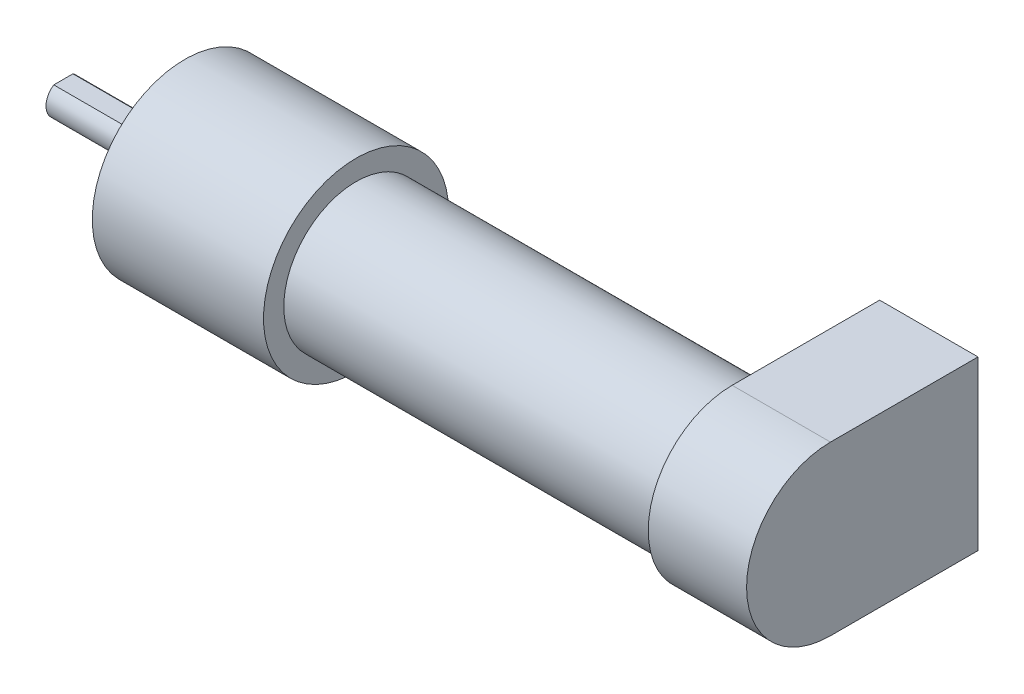
ISO-10303-21;
HEADER;
FILE_DESCRIPTION(('STEP AP214'),'2;1');
FILE_NAME('part.step','',(''),(''),'','','');
FILE_SCHEMA(('AUTOMOTIVE_DESIGN { 1 0 10303 214 1 1 1 1 }'));
ENDSEC;
DATA;
#1=APPLICATION_CONTEXT('core data for automotive mechanical design processes');
#2=APPLICATION_PROTOCOL_DEFINITION('international standard','automotive_design',2000,#1);
#3=PRODUCT_CONTEXT('',#1,'mechanical');
#4=PRODUCT('Part','Part','',(#3));
#5=PRODUCT_RELATED_PRODUCT_CATEGORY('part','',(#4));
#6=PRODUCT_DEFINITION_FORMATION('','',#4);
#7=PRODUCT_DEFINITION_CONTEXT('part definition',#1,'design');
#8=PRODUCT_DEFINITION('design','',#6,#7);
#9=PRODUCT_DEFINITION_SHAPE('','',#8);
#10=(LENGTH_UNIT() NAMED_UNIT(*) SI_UNIT(.MILLI.,.METRE.));
#11=(NAMED_UNIT(*) PLANE_ANGLE_UNIT() SI_UNIT($,.RADIAN.));
#12=(NAMED_UNIT(*) SI_UNIT($,.STERADIAN.) SOLID_ANGLE_UNIT());
#13=UNCERTAINTY_MEASURE_WITH_UNIT(LENGTH_MEASURE(1.E-05),#10,'distance_accuracy_value','');
#14=(GEOMETRIC_REPRESENTATION_CONTEXT(3) GLOBAL_UNCERTAINTY_ASSIGNED_CONTEXT((#13)) GLOBAL_UNIT_ASSIGNED_CONTEXT((#10,
#11,#12)) REPRESENTATION_CONTEXT('',''));
#15=CARTESIAN_POINT('',(0.,0.,0.));
#16=DIRECTION('',(0.,0.,1.));
#17=DIRECTION('',(1.,0.,0.));
#18=AXIS2_PLACEMENT_3D('',#15,#16,#17);
#19=CARTESIAN_POINT('',(-43.621133370613,-0.469072188427009,0.));
#20=DIRECTION('',(-1.,0.,0.));
#21=DIRECTION('',(0.,0.,1.));
#22=AXIS2_PLACEMENT_3D('',#19,#20,#21);
#23=PLANE('',#22);
#24=DIRECTION('',(0.,0.,-1.));
#25=VECTOR('',#24,1.);
#26=CARTESIAN_POINT('',(-43.621133370613,0.53092781157299,-1.6583123951777));
#27=LINE('',#26,#25);
#28=CARTESIAN_POINT('',(-43.621133370613,0.530927811572991,1.65831239517771));
#29=VERTEX_POINT('',#28);
#30=CARTESIAN_POINT('',(-43.621133370613,0.530927811572991,-1.65831239517771));
#31=VERTEX_POINT('',#30);
#32=EDGE_CURVE('E76',#29,#31,#27,.T.);
#33=ORIENTED_EDGE('',*,*,#32,.T.);
#34=CARTESIAN_POINT('',(-43.621133370613,-1.96907218842701,0.));
#35=DIRECTION('',(1.,0.,0.));
#36=DIRECTION('',(0.,0.,-1.));
#37=AXIS2_PLACEMENT_3D('',#34,#35,#36);
#38=CIRCLE('',#37,3.);
#39=EDGE_CURVE('E20',#29,#31,#38,.T.);
#40=ORIENTED_EDGE('',*,*,#39,.F.);
#41=EDGE_LOOP('',(#33,#40));
#42=FACE_BOUND('',#41,.T.);
#43=ADVANCED_FACE('F17',(#42),#23,.T.);
#44=CARTESIAN_POINT('',(-43.621133370613,0.53092781157299,-1.6583123951777));
#45=DIRECTION('',(0.,-1.,0.));
#46=DIRECTION('',(0.,0.,-1.));
#47=AXIS2_PLACEMENT_3D('',#44,#45,#46);
#48=PLANE('',#47);
#49=DIRECTION('',(1.,0.,0.));
#50=VECTOR('',#49,1.);
#51=CARTESIAN_POINT('',(-35.546133370613,0.530927811572992,-1.65831239517771));
#52=LINE('',#51,#50);
#53=CARTESIAN_POINT('',(-31.621133370613,0.530927811572991,-1.65831239517771));
#54=VERTEX_POINT('',#53);
#55=EDGE_CURVE('E85',#31,#54,#52,.T.);
#56=ORIENTED_EDGE('',*,*,#55,.F.);
#57=ORIENTED_EDGE('',*,*,#32,.F.);
#58=DIRECTION('',(1.,0.,0.));
#59=VECTOR('',#58,1.);
#60=CARTESIAN_POINT('',(-35.546133370613,0.530927811572991,1.65831239517771));
#61=LINE('',#60,#59);
#62=CARTESIAN_POINT('',(-31.621133370613,0.530927811572991,1.65831239517771));
#63=VERTEX_POINT('',#62);
#64=EDGE_CURVE('E95',#63,#29,#61,.F.);
#65=ORIENTED_EDGE('',*,*,#64,.F.);
#66=DIRECTION('',(0.,0.,-1.));
#67=VECTOR('',#66,1.);
#68=CARTESIAN_POINT('',(-31.621133370613,0.53092781157299,0.));
#69=LINE('',#68,#67);
#70=EDGE_CURVE('E82',#63,#54,#69,.T.);
#71=ORIENTED_EDGE('',*,*,#70,.T.);
#72=EDGE_LOOP('',(#56,#57,#65,#71));
#73=FACE_BOUND('',#72,.T.);
#74=ADVANCED_FACE('F86',(#73),#48,.F.);
#75=CARTESIAN_POINT('',(-31.621133370613,0.68440672503776,0.));
#76=DIRECTION('',(1.,0.,0.));
#77=DIRECTION('',(0.,0.,-1.));
#78=AXIS2_PLACEMENT_3D('',#75,#76,#77);
#79=PLANE('',#78);
#80=ORIENTED_EDGE('',*,*,#70,.F.);
#81=CARTESIAN_POINT('',(-31.621133370613,-1.96907218842701,0.));
#82=DIRECTION('',(1.,0.,0.));
#83=DIRECTION('',(0.,0.,-1.));
#84=AXIS2_PLACEMENT_3D('',#81,#82,#83);
#85=CIRCLE('',#84,3.);
#86=EDGE_CURVE('E92',#54,#63,#85,.T.);
#87=ORIENTED_EDGE('',*,*,#86,.F.);
#88=EDGE_LOOP('',(#80,#87));
#89=FACE_BOUND('',#88,.T.);
#90=ADVANCED_FACE('F148',(#89),#79,.F.);
#91=CARTESIAN_POINT('',(-35.546133370613,-1.96907218842701,0.));
#92=DIRECTION('',(1.,0.,0.));
#93=DIRECTION('',(0.,0.,-1.));
#94=AXIS2_PLACEMENT_3D('',#91,#92,#93);
#95=CYLINDRICAL_SURFACE('',#94,3.);
#96=CARTESIAN_POINT('',(-27.471133370613,-1.96907218842701,0.));
#97=DIRECTION('',(1.,0.,0.));
#98=DIRECTION('',(0.,0.,-1.));
#99=AXIS2_PLACEMENT_3D('',#96,#97,#98);
#100=CIRCLE('',#99,3.);
#101=CARTESIAN_POINT('',(-27.471133370613,-1.96907218842701,-3.));
#102=VERTEX_POINT('',#101);
#103=EDGE_CURVE('E144',#102,#102,#100,.T.);
#104=ORIENTED_EDGE('',*,*,#103,.F.);
#105=EDGE_LOOP('',(#104));
#106=FACE_BOUND('',#105,.T.);
#107=ORIENTED_EDGE('',*,*,#55,.T.);
#108=ORIENTED_EDGE('',*,*,#86,.T.);
#109=ORIENTED_EDGE('',*,*,#64,.T.);
#110=ORIENTED_EDGE('',*,*,#39,.T.);
#111=EDGE_LOOP('',(#107,#108,#109,#110));
#112=FACE_BOUND('',#111,.T.);
#113=ADVANCED_FACE('F94',(#106,#112),#95,.T.);
#114=CARTESIAN_POINT('',(-27.471133370613,2.63232422173897,0.));
#115=DIRECTION('',(-1.,0.,0.));
#116=DIRECTION('',(0.,0.,1.));
#117=AXIS2_PLACEMENT_3D('',#114,#115,#116);
#118=PLANE('',#117);
#119=ORIENTED_EDGE('',*,*,#103,.T.);
#120=EDGE_LOOP('',(#119));
#121=FACE_BOUND('',#120,.T.);
#122=CARTESIAN_POINT('',(-27.471133370613,-1.96907218842701,0.));
#123=DIRECTION('',(1.,0.,0.));
#124=DIRECTION('',(0.,0.,-1.));
#125=AXIS2_PLACEMENT_3D('',#122,#123,#124);
#126=CIRCLE('',#125,6.20279282033196);
#127=CARTESIAN_POINT('',(-27.471133370613,-1.96907218842701,-6.20279282033196));
#128=VERTEX_POINT('',#127);
#129=EDGE_CURVE('E141',#128,#128,#126,.T.);
#130=ORIENTED_EDGE('',*,*,#129,.F.);
#131=EDGE_LOOP('',(#130));
#132=FACE_BOUND('',#131,.T.);
#133=ADVANCED_FACE('F156',(#121,#132),#118,.T.);
#134=CARTESIAN_POINT('',(-26.171133370613,-1.96907218842701,0.));
#135=DIRECTION('',(1.,0.,0.));
#136=DIRECTION('',(0.,0.,-1.));
#137=AXIS2_PLACEMENT_3D('',#134,#135,#136);
#138=CYLINDRICAL_SURFACE('',#137,6.20279282033196);
#139=ORIENTED_EDGE('',*,*,#129,.T.);
#140=EDGE_LOOP('',(#139));
#141=FACE_BOUND('',#140,.T.);
#142=CARTESIAN_POINT('',(-24.871133370613,-1.96907218842701,0.));
#143=DIRECTION('',(1.,0.,0.));
#144=DIRECTION('',(0.,0.,-1.));
#145=AXIS2_PLACEMENT_3D('',#142,#143,#144);
#146=CIRCLE('',#145,6.20279282033196);
#147=CARTESIAN_POINT('',(-24.871133370613,-1.96907218842701,-6.20279282033196));
#148=VERTEX_POINT('',#147);
#149=EDGE_CURVE('E137',#148,#148,#146,.T.);
#150=ORIENTED_EDGE('',*,*,#149,.F.);
#151=EDGE_LOOP('',(#150));
#152=FACE_BOUND('',#151,.T.);
#153=ADVANCED_FACE('F209',(#141,#152),#138,.T.);
#154=CARTESIAN_POINT('',(-24.871133370613,5.88232422173897,0.));
#155=DIRECTION('',(-1.,0.,0.));
#156=DIRECTION('',(0.,0.,1.));
#157=AXIS2_PLACEMENT_3D('',#154,#155,#156);
#158=PLANE('',#157);
#159=ORIENTED_EDGE('',*,*,#149,.T.);
#160=EDGE_LOOP('',(#159));
#161=FACE_BOUND('',#160,.T.);
#162=CARTESIAN_POINT('',(-24.871133370613,-1.96907218842701,0.));
#163=DIRECTION('',(1.,0.,0.));
#164=DIRECTION('',(0.,0.,-1.));
#165=AXIS2_PLACEMENT_3D('',#162,#163,#164);
#166=CIRCLE('',#165,9.5);
#167=CARTESIAN_POINT('',(-24.871133370613,-1.96907218842701,-9.5));
#168=VERTEX_POINT('',#167);
#169=EDGE_CURVE('E133',#168,#168,#166,.T.);
#170=ORIENTED_EDGE('',*,*,#169,.F.);
#171=EDGE_LOOP('',(#170));
#172=FACE_BOUND('',#171,.T.);
#173=ADVANCED_FACE('F205',(#161,#172),#158,.T.);
#174=CARTESIAN_POINT('',(-23.746133370613,-1.96907218842701,0.));
#175=DIRECTION('',(1.,0.,0.));
#176=DIRECTION('',(0.,0.,-1.));
#177=AXIS2_PLACEMENT_3D('',#174,#175,#176);
#178=CYLINDRICAL_SURFACE('',#177,9.5);
#179=ORIENTED_EDGE('',*,*,#169,.T.);
#180=EDGE_LOOP('',(#179));
#181=FACE_BOUND('',#180,.T.);
#182=CARTESIAN_POINT('',(-22.621133370613,-1.96907218842701,0.));
#183=DIRECTION('',(1.,0.,0.));
#184=DIRECTION('',(0.,0.,-1.));
#185=AXIS2_PLACEMENT_3D('',#182,#183,#184);
#186=CIRCLE('',#185,9.5);
#187=CARTESIAN_POINT('',(-22.621133370613,-1.96907218842701,-9.5));
#188=VERTEX_POINT('',#187);
#189=EDGE_CURVE('E128',#188,#188,#186,.T.);
#190=ORIENTED_EDGE('',*,*,#189,.F.);
#191=EDGE_LOOP('',(#190));
#192=FACE_BOUND('',#191,.T.);
#193=ADVANCED_FACE('F201',(#181,#192),#178,.T.);
#194=CARTESIAN_POINT('',(88.978866629387,-1.96907218842701,-8.04939564502267));
#195=DIRECTION('',(1.,0.,0.));
#196=DIRECTION('',(0.,0.,-1.));
#197=AXIS2_PLACEMENT_3D('',#194,#195,#196);
#198=PLANE('',#197);
#199=DIRECTION('',(0.,0.,-1.));
#200=VECTOR('',#199,1.);
#201=CARTESIAN_POINT('',(88.978866629387,-16.469072188427,-25.5));
#202=LINE('',#201,#200);
#203=CARTESIAN_POINT('',(88.978866629387,-16.469072188427,-25.5));
#204=VERTEX_POINT('',#203);
#205=CARTESIAN_POINT('',(88.978866629387,-16.469072188427,0.));
#206=VERTEX_POINT('',#205);
#207=EDGE_CURVE('E132',#204,#206,#202,.F.);
#208=ORIENTED_EDGE('',*,*,#207,.F.);
#209=DIRECTION('',(0.,1.,0.));
#210=VECTOR('',#209,1.);
#211=CARTESIAN_POINT('',(88.978866629387,12.530927811573,-25.5));
#212=LINE('',#211,#210);
#213=CARTESIAN_POINT('',(88.978866629387,12.530927811573,-25.5));
#214=VERTEX_POINT('',#213);
#215=EDGE_CURVE('E311',#214,#204,#212,.F.);
#216=ORIENTED_EDGE('',*,*,#215,.F.);
#217=DIRECTION('',(0.,0.,1.));
#218=VECTOR('',#217,1.);
#219=CARTESIAN_POINT('',(88.978866629387,12.530927811573,0.));
#220=LINE('',#219,#218);
#221=CARTESIAN_POINT('',(88.978866629387,12.530927811573,0.));
#222=VERTEX_POINT('',#221);
#223=EDGE_CURVE('E322',#222,#214,#220,.F.);
#224=ORIENTED_EDGE('',*,*,#223,.F.);
#225=CARTESIAN_POINT('',(88.978866629387,-1.96907218842701,0.));
#226=DIRECTION('',(1.,0.,0.));
#227=DIRECTION('',(0.,0.,-1.));
#228=AXIS2_PLACEMENT_3D('',#225,#226,#227);
#229=CIRCLE('',#228,14.5);
#230=EDGE_CURVE('E122',#206,#222,#229,.F.);
#231=ORIENTED_EDGE('',*,*,#230,.F.);
#232=EDGE_LOOP('',(#208,#216,#224,#231));
#233=FACE_BOUND('',#232,.T.);
#234=ADVANCED_FACE('F197',(#233),#198,.T.);
#235=CARTESIAN_POINT('',(-22.621133370613,10.780927811573,0.));
#236=DIRECTION('',(-1.,0.,0.));
#237=DIRECTION('',(0.,0.,1.));
#238=AXIS2_PLACEMENT_3D('',#235,#236,#237);
#239=PLANE('',#238);
#240=ORIENTED_EDGE('',*,*,#189,.T.);
#241=EDGE_LOOP('',(#240));
#242=FACE_BOUND('',#241,.T.);
#243=CARTESIAN_POINT('',(-22.621133370613,-1.96907218842701,0.));
#244=DIRECTION('',(1.,0.,0.));
#245=DIRECTION('',(0.,0.,-1.));
#246=AXIS2_PLACEMENT_3D('',#243,#244,#245);
#247=CIRCLE('',#246,16.);
#248=CARTESIAN_POINT('',(-22.621133370613,-1.96907218842701,-16.));
#249=VERTEX_POINT('',#248);
#250=EDGE_CURVE('E116',#249,#249,#247,.T.);
#251=ORIENTED_EDGE('',*,*,#250,.F.);
#252=EDGE_LOOP('',(#251));
#253=FACE_BOUND('',#252,.T.);
#254=ADVANCED_FACE('F193',(#242,#253),#239,.T.);
#255=CARTESIAN_POINT('',(71.978866629387,-16.469072188427,-25.5));
#256=DIRECTION('',(0.,-1.,0.));
#257=DIRECTION('',(0.,0.,-1.));
#258=AXIS2_PLACEMENT_3D('',#255,#256,#257);
#259=PLANE('',#258);
#260=DIRECTION('',(0.,0.,-1.));
#261=VECTOR('',#260,1.);
#262=CARTESIAN_POINT('',(71.978866629387,-16.469072188427,-8.04939564502267));
#263=LINE('',#262,#261);
#264=CARTESIAN_POINT('',(71.978866629387,-16.469072188427,0.));
#265=VERTEX_POINT('',#264);
#266=CARTESIAN_POINT('',(71.978866629387,-16.469072188427,-25.5));
#267=VERTEX_POINT('',#266);
#268=EDGE_CURVE('E120',#265,#267,#263,.T.);
#269=ORIENTED_EDGE('',*,*,#268,.T.);
#270=DIRECTION('',(-1.,0.,0.));
#271=VECTOR('',#270,1.);
#272=CARTESIAN_POINT('',(71.978866629387,-16.469072188427,-25.5));
#273=LINE('',#272,#271);
#274=EDGE_CURVE('E318',#204,#267,#273,.T.);
#275=ORIENTED_EDGE('',*,*,#274,.F.);
#276=ORIENTED_EDGE('',*,*,#207,.T.);
#277=DIRECTION('',(1.,0.,0.));
#278=VECTOR('',#277,1.);
#279=CARTESIAN_POINT('',(71.978866629387,-16.469072188427,0.));
#280=LINE('',#279,#278);
#281=EDGE_CURVE('E121',#265,#206,#280,.T.);
#282=ORIENTED_EDGE('',*,*,#281,.F.);
#283=EDGE_LOOP('',(#269,#275,#276,#282));
#284=FACE_BOUND('',#283,.T.);
#285=ADVANCED_FACE('F189',(#284),#259,.T.);
#286=CARTESIAN_POINT('',(71.978866629387,12.530927811573,-25.5));
#287=DIRECTION('',(0.,0.,-1.));
#288=DIRECTION('',(-1.,0.,0.));
#289=AXIS2_PLACEMENT_3D('',#286,#287,#288);
#290=PLANE('',#289);
#291=DIRECTION('',(0.,1.,0.));
#292=VECTOR('',#291,1.);
#293=CARTESIAN_POINT('',(71.978866629387,-1.96907218842701,-25.5));
#294=LINE('',#293,#292);
#295=CARTESIAN_POINT('',(71.978866629387,12.530927811573,-25.5));
#296=VERTEX_POINT('',#295);
#297=EDGE_CURVE('E340',#267,#296,#294,.T.);
#298=ORIENTED_EDGE('',*,*,#297,.T.);
#299=DIRECTION('',(1.,0.,0.));
#300=VECTOR('',#299,1.);
#301=CARTESIAN_POINT('',(71.978866629387,12.530927811573,-25.5));
#302=LINE('',#301,#300);
#303=EDGE_CURVE('E127',#214,#296,#302,.F.);
#304=ORIENTED_EDGE('',*,*,#303,.F.);
#305=ORIENTED_EDGE('',*,*,#215,.T.);
#306=ORIENTED_EDGE('',*,*,#274,.T.);
#307=EDGE_LOOP('',(#298,#304,#305,#306));
#308=FACE_BOUND('',#307,.T.);
#309=ADVANCED_FACE('F186',(#308),#290,.T.);
#310=CARTESIAN_POINT('',(71.978866629387,12.530927811573,0.));
#311=DIRECTION('',(0.,1.,0.));
#312=DIRECTION('',(0.,0.,1.));
#313=AXIS2_PLACEMENT_3D('',#310,#311,#312);
#314=PLANE('',#313);
#315=DIRECTION('',(0.,0.,-1.));
#316=VECTOR('',#315,1.);
#317=CARTESIAN_POINT('',(71.978866629387,12.530927811573,-8.04939564502267));
#318=LINE('',#317,#316);
#319=CARTESIAN_POINT('',(71.978866629387,12.530927811573,0.));
#320=VERTEX_POINT('',#319);
#321=EDGE_CURVE('E40',#296,#320,#318,.F.);
#322=ORIENTED_EDGE('',*,*,#321,.T.);
#323=DIRECTION('',(1.,0.,0.));
#324=VECTOR('',#323,1.);
#325=CARTESIAN_POINT('',(71.978866629387,12.530927811573,0.));
#326=LINE('',#325,#324);
#327=EDGE_CURVE('E126',#222,#320,#326,.F.);
#328=ORIENTED_EDGE('',*,*,#327,.F.);
#329=ORIENTED_EDGE('',*,*,#223,.T.);
#330=ORIENTED_EDGE('',*,*,#303,.T.);
#331=EDGE_LOOP('',(#322,#328,#329,#330));
#332=FACE_BOUND('',#331,.T.);
#333=ADVANCED_FACE('F182',(#332),#314,.T.);
#334=CARTESIAN_POINT('',(71.978866629387,-1.96907218842701,0.));
#335=DIRECTION('',(1.,0.,0.));
#336=DIRECTION('',(0.,0.,-1.));
#337=AXIS2_PLACEMENT_3D('',#334,#335,#336);
#338=CYLINDRICAL_SURFACE('',#337,14.5);
#339=CARTESIAN_POINT('',(71.978866629387,-1.96907218842701,0.));
#340=DIRECTION('',(1.,0.,0.));
#341=DIRECTION('',(0.,0.,-1.));
#342=AXIS2_PLACEMENT_3D('',#339,#340,#341);
#343=CIRCLE('',#342,14.5);
#344=EDGE_CURVE('E112',#320,#265,#343,.T.);
#345=ORIENTED_EDGE('',*,*,#344,.T.);
#346=ORIENTED_EDGE('',*,*,#281,.T.);
#347=ORIENTED_EDGE('',*,*,#230,.T.);
#348=ORIENTED_EDGE('',*,*,#327,.T.);
#349=EDGE_LOOP('',(#345,#346,#347,#348));
#350=FACE_BOUND('',#349,.T.);
#351=ADVANCED_FACE('F178',(#350),#338,.T.);
#352=CARTESIAN_POINT('',(-7.82113337061301,-1.96907218842701,0.));
#353=DIRECTION('',(1.,0.,0.));
#354=DIRECTION('',(0.,0.,-1.));
#355=AXIS2_PLACEMENT_3D('',#352,#353,#354);
#356=CYLINDRICAL_SURFACE('',#355,16.);
#357=ORIENTED_EDGE('',*,*,#250,.T.);
#358=EDGE_LOOP('',(#357));
#359=FACE_BOUND('',#358,.T.);
#360=CARTESIAN_POINT('',(6.97886662938699,-1.96907218842701,0.));
#361=DIRECTION('',(1.,0.,0.));
#362=DIRECTION('',(0.,0.,-1.));
#363=AXIS2_PLACEMENT_3D('',#360,#361,#362);
#364=CIRCLE('',#363,16.);
#365=CARTESIAN_POINT('',(6.97886662938699,-1.96907218842701,-16.));
#366=VERTEX_POINT('',#365);
#367=EDGE_CURVE('E108',#366,#366,#364,.T.);
#368=ORIENTED_EDGE('',*,*,#367,.F.);
#369=EDGE_LOOP('',(#368));
#370=FACE_BOUND('',#369,.T.);
#371=ADVANCED_FACE('F174',(#359,#370),#356,.T.);
#372=CARTESIAN_POINT('',(71.978866629387,-1.96907218842701,-8.04939564502267));
#373=DIRECTION('',(1.,0.,0.));
#374=DIRECTION('',(0.,0.,-1.));
#375=AXIS2_PLACEMENT_3D('',#372,#373,#374);
#376=PLANE('',#375);
#377=CARTESIAN_POINT('',(71.978866629387,-1.96907218842701,0.));
#378=DIRECTION('',(1.,0.,0.));
#379=DIRECTION('',(0.,0.,-1.));
#380=AXIS2_PLACEMENT_3D('',#377,#378,#379);
#381=CIRCLE('',#380,12.5);
#382=CARTESIAN_POINT('',(71.978866629387,-1.96907218842701,-12.5));
#383=VERTEX_POINT('',#382);
#384=EDGE_CURVE('E27',#383,#383,#381,.F.);
#385=ORIENTED_EDGE('',*,*,#384,.F.);
#386=EDGE_LOOP('',(#385));
#387=FACE_BOUND('',#386,.T.);
#388=ORIENTED_EDGE('',*,*,#321,.F.);
#389=ORIENTED_EDGE('',*,*,#297,.F.);
#390=ORIENTED_EDGE('',*,*,#268,.F.);
#391=ORIENTED_EDGE('',*,*,#344,.F.);
#392=EDGE_LOOP('',(#388,#389,#390,#391));
#393=FACE_BOUND('',#392,.T.);
#394=ADVANCED_FACE('F167',(#387,#393),#376,.F.);
#395=CARTESIAN_POINT('',(6.97886662938699,12.280927811573,0.));
#396=DIRECTION('',(1.,0.,0.));
#397=DIRECTION('',(0.,0.,-1.));
#398=AXIS2_PLACEMENT_3D('',#395,#396,#397);
#399=PLANE('',#398);
#400=CARTESIAN_POINT('',(6.97886662938699,-1.96907218842701,0.));
#401=DIRECTION('',(1.,0.,0.));
#402=DIRECTION('',(0.,0.,-1.));
#403=AXIS2_PLACEMENT_3D('',#400,#401,#402);
#404=CIRCLE('',#403,12.5);
#405=CARTESIAN_POINT('',(6.97886662938699,-1.96907218842701,-12.5));
#406=VERTEX_POINT('',#405);
#407=EDGE_CURVE('E11',#406,#406,#404,.T.);
#408=ORIENTED_EDGE('',*,*,#407,.F.);
#409=EDGE_LOOP('',(#408));
#410=FACE_BOUND('',#409,.T.);
#411=ORIENTED_EDGE('',*,*,#367,.T.);
#412=EDGE_LOOP('',(#411));
#413=FACE_BOUND('',#412,.T.);
#414=ADVANCED_FACE('F161',(#410,#413),#399,.T.);
#415=CARTESIAN_POINT('',(66.728866629387,-1.96907218842701,0.));
#416=DIRECTION('',(1.,0.,0.));
#417=DIRECTION('',(0.,0.,-1.));
#418=AXIS2_PLACEMENT_3D('',#415,#416,#417);
#419=CYLINDRICAL_SURFACE('',#418,12.5);
#420=ORIENTED_EDGE('',*,*,#407,.T.);
#421=EDGE_LOOP('',(#420));
#422=FACE_BOUND('',#421,.T.);
#423=ORIENTED_EDGE('',*,*,#384,.T.);
#424=EDGE_LOOP('',(#423));
#425=FACE_BOUND('',#424,.T.);
#426=ADVANCED_FACE('F159',(#422,#425),#419,.T.);
#427=CLOSED_SHELL('',(#43,#74,#90,#113,#133,#153,#173,#193,#234,#254,#285,#309,#333,#351,#371,
#394,#414,#426));
#428=MANIFOLD_SOLID_BREP('B1',#427);
#429=ADVANCED_BREP_SHAPE_REPRESENTATION('',(#18,#428),#14);
#430=SHAPE_DEFINITION_REPRESENTATION(#9,#429);
ENDSEC;
END-ISO-10303-21;
